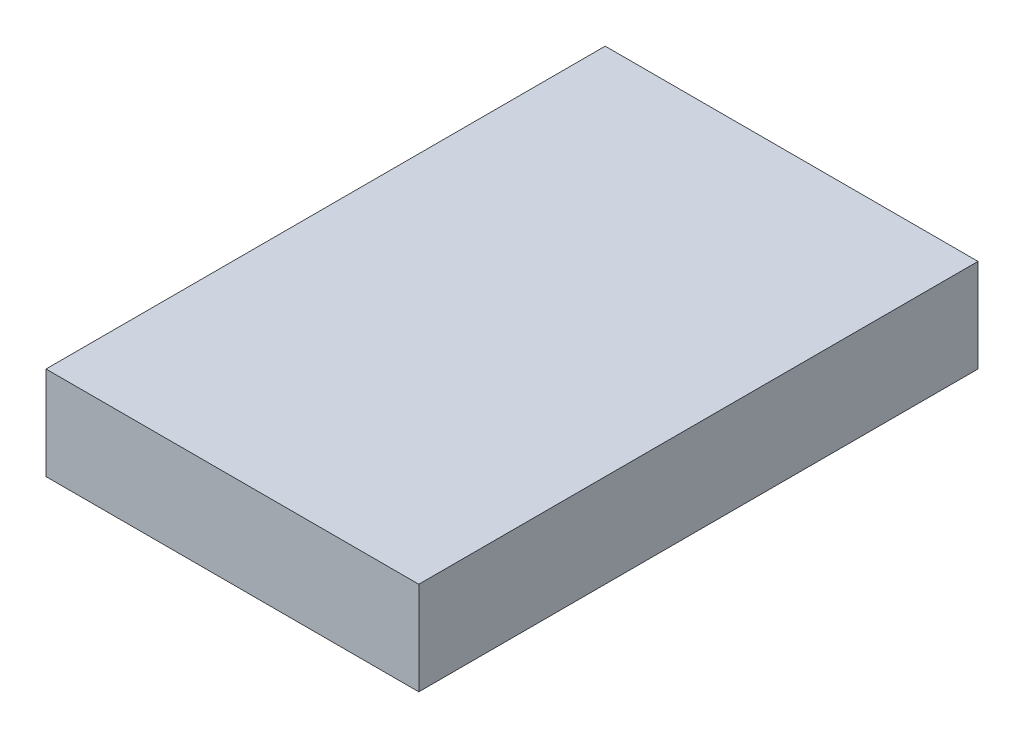
ISO-10303-21;
HEADER;
FILE_DESCRIPTION(('STEP AP214'),'2;1');
FILE_NAME('part.step','',(''),(''),'','','');
FILE_SCHEMA(('AUTOMOTIVE_DESIGN { 1 0 10303 214 1 1 1 1 }'));
ENDSEC;
DATA;
#1=APPLICATION_CONTEXT('core data for automotive mechanical design processes');
#2=APPLICATION_PROTOCOL_DEFINITION('international standard','automotive_design',2000,#1);
#3=PRODUCT_CONTEXT('',#1,'mechanical');
#4=PRODUCT('Part','Part','',(#3));
#5=PRODUCT_RELATED_PRODUCT_CATEGORY('part','',(#4));
#6=PRODUCT_DEFINITION_FORMATION('','',#4);
#7=PRODUCT_DEFINITION_CONTEXT('part definition',#1,'design');
#8=PRODUCT_DEFINITION('design','',#6,#7);
#9=PRODUCT_DEFINITION_SHAPE('','',#8);
#10=(LENGTH_UNIT() NAMED_UNIT(*) SI_UNIT(.MILLI.,.METRE.));
#11=(NAMED_UNIT(*) PLANE_ANGLE_UNIT() SI_UNIT($,.RADIAN.));
#12=(NAMED_UNIT(*) SI_UNIT($,.STERADIAN.) SOLID_ANGLE_UNIT());
#13=UNCERTAINTY_MEASURE_WITH_UNIT(LENGTH_MEASURE(1.E-05),#10,'distance_accuracy_value','');
#14=(GEOMETRIC_REPRESENTATION_CONTEXT(3) GLOBAL_UNCERTAINTY_ASSIGNED_CONTEXT((#13)) GLOBAL_UNIT_ASSIGNED_CONTEXT((#10,
#11,#12)) REPRESENTATION_CONTEXT('',''));
#15=CARTESIAN_POINT('',(0.,0.,0.));
#16=DIRECTION('',(0.,0.,1.));
#17=DIRECTION('',(1.,0.,0.));
#18=AXIS2_PLACEMENT_3D('',#15,#16,#17);
#19=CARTESIAN_POINT('',(10.,5.,15.));
#20=DIRECTION('',(-1.,0.,0.));
#21=DIRECTION('',(0.,0.,1.));
#22=AXIS2_PLACEMENT_3D('',#19,#20,#21);
#23=PLANE('',#22);
#24=DIRECTION('',(0.,0.,-1.));
#25=VECTOR('',#24,1.);
#26=CARTESIAN_POINT('',(10.,0.,15.));
#27=LINE('',#26,#25);
#28=CARTESIAN_POINT('',(10.,0.,15.));
#29=VERTEX_POINT('',#28);
#30=CARTESIAN_POINT('',(10.,0.,-15.));
#31=VERTEX_POINT('',#30);
#32=EDGE_CURVE('E107',#29,#31,#27,.T.);
#33=ORIENTED_EDGE('',*,*,#32,.T.);
#34=DIRECTION('',(0.,-1.,0.));
#35=VECTOR('',#34,1.);
#36=CARTESIAN_POINT('',(10.,5.,-15.));
#37=LINE('',#36,#35);
#38=CARTESIAN_POINT('',(10.,5.,-15.));
#39=VERTEX_POINT('',#38);
#40=EDGE_CURVE('E11',#39,#31,#37,.T.);
#41=ORIENTED_EDGE('',*,*,#40,.F.);
#42=DIRECTION('',(0.,0.,-1.));
#43=VECTOR('',#42,1.);
#44=CARTESIAN_POINT('',(10.,5.,15.));
#45=LINE('',#44,#43);
#46=CARTESIAN_POINT('',(10.,5.,15.));
#47=VERTEX_POINT('',#46);
#48=EDGE_CURVE('E91',#47,#39,#45,.T.);
#49=ORIENTED_EDGE('',*,*,#48,.F.);
#50=DIRECTION('',(0.,-1.,0.));
#51=VECTOR('',#50,1.);
#52=CARTESIAN_POINT('',(10.,5.,15.));
#53=LINE('',#52,#51);
#54=EDGE_CURVE('E103',#47,#29,#53,.T.);
#55=ORIENTED_EDGE('',*,*,#54,.T.);
#56=EDGE_LOOP('',(#33,#41,#49,#55));
#57=FACE_BOUND('',#56,.T.);
#58=ADVANCED_FACE('F39',(#57),#23,.F.);
#59=CARTESIAN_POINT('',(-10.,5.,-15.));
#60=DIRECTION('',(0.,0.,1.));
#61=DIRECTION('',(1.,0.,0.));
#62=AXIS2_PLACEMENT_3D('',#59,#60,#61);
#63=PLANE('',#62);
#64=DIRECTION('',(-1.,0.,0.));
#65=VECTOR('',#64,1.);
#66=CARTESIAN_POINT('',(-10.,0.,-15.));
#67=LINE('',#66,#65);
#68=CARTESIAN_POINT('',(-10.,0.,-15.));
#69=VERTEX_POINT('',#68);
#70=EDGE_CURVE('E96',#31,#69,#67,.T.);
#71=ORIENTED_EDGE('',*,*,#70,.T.);
#72=DIRECTION('',(0.,-1.,0.));
#73=VECTOR('',#72,1.);
#74=CARTESIAN_POINT('',(-10.,5.,-15.));
#75=LINE('',#74,#73);
#76=CARTESIAN_POINT('',(-10.,5.,-15.));
#77=VERTEX_POINT('',#76);
#78=EDGE_CURVE('E48',#77,#69,#75,.T.);
#79=ORIENTED_EDGE('',*,*,#78,.F.);
#80=DIRECTION('',(-1.,0.,0.));
#81=VECTOR('',#80,1.);
#82=CARTESIAN_POINT('',(-10.,5.,-15.));
#83=LINE('',#82,#81);
#84=EDGE_CURVE('E86',#39,#77,#83,.T.);
#85=ORIENTED_EDGE('',*,*,#84,.F.);
#86=ORIENTED_EDGE('',*,*,#40,.T.);
#87=EDGE_LOOP('',(#71,#79,#85,#86));
#88=FACE_BOUND('',#87,.T.);
#89=ADVANCED_FACE('F95',(#88),#63,.F.);
#90=CARTESIAN_POINT('',(-10.,5.,15.));
#91=DIRECTION('',(1.,0.,0.));
#92=DIRECTION('',(0.,0.,-1.));
#93=AXIS2_PLACEMENT_3D('',#90,#91,#92);
#94=PLANE('',#93);
#95=DIRECTION('',(0.,0.,1.));
#96=VECTOR('',#95,1.);
#97=CARTESIAN_POINT('',(-10.,0.,15.));
#98=LINE('',#97,#96);
#99=CARTESIAN_POINT('',(-10.,0.,15.));
#100=VERTEX_POINT('',#99);
#101=EDGE_CURVE('E73',#69,#100,#98,.T.);
#102=ORIENTED_EDGE('',*,*,#101,.T.);
#103=DIRECTION('',(0.,-1.,0.));
#104=VECTOR('',#103,1.);
#105=CARTESIAN_POINT('',(-10.,5.,15.));
#106=LINE('',#105,#104);
#107=CARTESIAN_POINT('',(-10.,5.,15.));
#108=VERTEX_POINT('',#107);
#109=EDGE_CURVE('E98',#108,#100,#106,.T.);
#110=ORIENTED_EDGE('',*,*,#109,.F.);
#111=DIRECTION('',(0.,0.,1.));
#112=VECTOR('',#111,1.);
#113=CARTESIAN_POINT('',(-10.,5.,15.));
#114=LINE('',#113,#112);
#115=EDGE_CURVE('E89',#77,#108,#114,.T.);
#116=ORIENTED_EDGE('',*,*,#115,.F.);
#117=ORIENTED_EDGE('',*,*,#78,.T.);
#118=EDGE_LOOP('',(#102,#110,#116,#117));
#119=FACE_BOUND('',#118,.T.);
#120=ADVANCED_FACE('F99',(#119),#94,.F.);
#121=CARTESIAN_POINT('',(-10.,5.,15.));
#122=DIRECTION('',(0.,0.,-1.));
#123=DIRECTION('',(-1.,0.,0.));
#124=AXIS2_PLACEMENT_3D('',#121,#122,#123);
#125=PLANE('',#124);
#126=DIRECTION('',(1.,0.,0.));
#127=VECTOR('',#126,1.);
#128=CARTESIAN_POINT('',(-10.,0.,15.));
#129=LINE('',#128,#127);
#130=EDGE_CURVE('E79',#100,#29,#129,.T.);
#131=ORIENTED_EDGE('',*,*,#130,.T.);
#132=ORIENTED_EDGE('',*,*,#54,.F.);
#133=DIRECTION('',(1.,0.,0.));
#134=VECTOR('',#133,1.);
#135=CARTESIAN_POINT('',(-10.,5.,15.));
#136=LINE('',#135,#134);
#137=EDGE_CURVE('E56',#108,#47,#136,.T.);
#138=ORIENTED_EDGE('',*,*,#137,.F.);
#139=ORIENTED_EDGE('',*,*,#109,.T.);
#140=EDGE_LOOP('',(#131,#132,#138,#139));
#141=FACE_BOUND('',#140,.T.);
#142=ADVANCED_FACE('F120',(#141),#125,.F.);
#143=CARTESIAN_POINT('',(0.,5.,0.));
#144=DIRECTION('',(0.,-1.,0.));
#145=DIRECTION('',(0.,0.,-1.));
#146=AXIS2_PLACEMENT_3D('',#143,#144,#145);
#147=PLANE('',#146);
#148=ORIENTED_EDGE('',*,*,#48,.T.);
#149=ORIENTED_EDGE('',*,*,#84,.T.);
#150=ORIENTED_EDGE('',*,*,#115,.T.);
#151=ORIENTED_EDGE('',*,*,#137,.T.);
#152=EDGE_LOOP('',(#148,#149,#150,#151));
#153=FACE_BOUND('',#152,.T.);
#154=ADVANCED_FACE('F87',(#153),#147,.F.);
#155=CARTESIAN_POINT('',(0.,0.,0.));
#156=DIRECTION('',(0.,-1.,0.));
#157=DIRECTION('',(0.,0.,-1.));
#158=AXIS2_PLACEMENT_3D('',#155,#156,#157);
#159=PLANE('',#158);
#160=ORIENTED_EDGE('',*,*,#32,.F.);
#161=ORIENTED_EDGE('',*,*,#130,.F.);
#162=ORIENTED_EDGE('',*,*,#101,.F.);
#163=ORIENTED_EDGE('',*,*,#70,.F.);
#164=EDGE_LOOP('',(#160,#161,#162,#163));
#165=FACE_BOUND('',#164,.T.);
#166=ADVANCED_FACE('F123',(#165),#159,.T.);
#167=CLOSED_SHELL('',(#58,#89,#120,#142,#154,#166));
#168=MANIFOLD_SOLID_BREP('B2',#167);
#169=ADVANCED_BREP_SHAPE_REPRESENTATION('',(#18,#168),#14);
#170=SHAPE_DEFINITION_REPRESENTATION(#9,#169);
ENDSEC;
END-ISO-10303-21;
